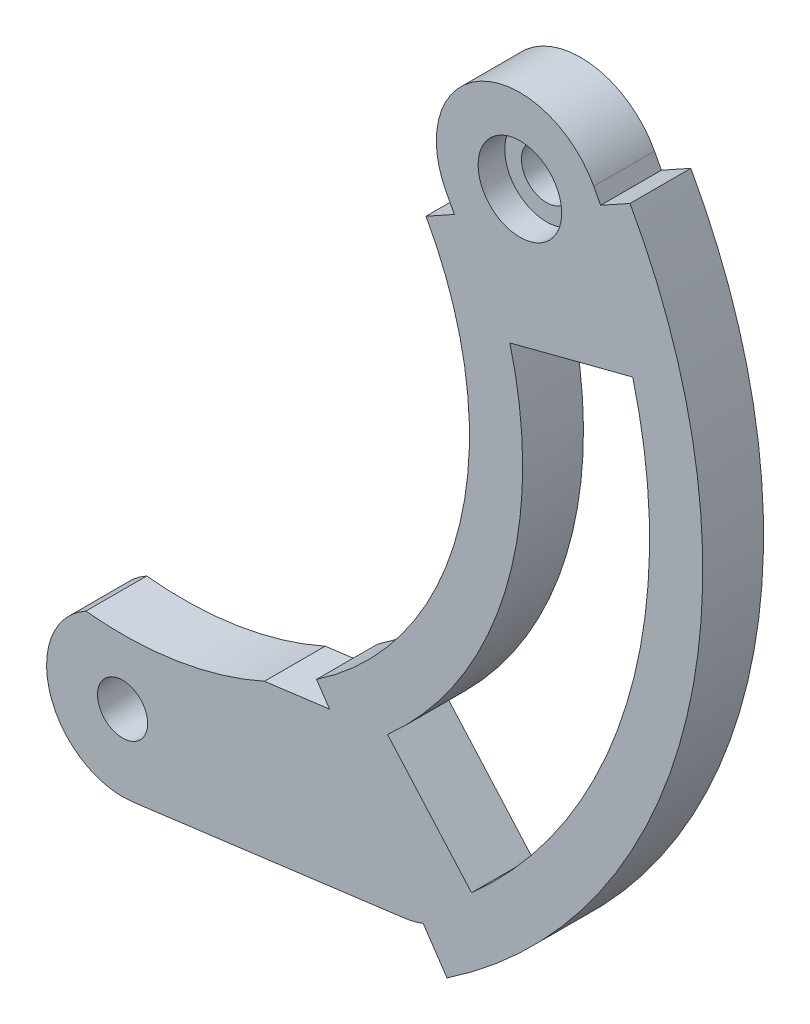
ISO-10303-21;
HEADER;
FILE_DESCRIPTION(('STEP AP214'),'2;1');
FILE_NAME('part.step','',(''),(''),'','','');
FILE_SCHEMA(('AUTOMOTIVE_DESIGN { 1 0 10303 214 1 1 1 1 }'));
ENDSEC;
DATA;
#1=APPLICATION_CONTEXT('core data for automotive mechanical design processes');
#2=APPLICATION_PROTOCOL_DEFINITION('international standard','automotive_design',2000,#1);
#3=PRODUCT_CONTEXT('',#1,'mechanical');
#4=PRODUCT('Part','Part','',(#3));
#5=PRODUCT_RELATED_PRODUCT_CATEGORY('part','',(#4));
#6=PRODUCT_DEFINITION_FORMATION('','',#4);
#7=PRODUCT_DEFINITION_CONTEXT('part definition',#1,'design');
#8=PRODUCT_DEFINITION('design','',#6,#7);
#9=PRODUCT_DEFINITION_SHAPE('','',#8);
#10=(LENGTH_UNIT() NAMED_UNIT(*) SI_UNIT(.MILLI.,.METRE.));
#11=(NAMED_UNIT(*) PLANE_ANGLE_UNIT() SI_UNIT($,.RADIAN.));
#12=(NAMED_UNIT(*) SI_UNIT($,.STERADIAN.) SOLID_ANGLE_UNIT());
#13=UNCERTAINTY_MEASURE_WITH_UNIT(LENGTH_MEASURE(1.E-05),#10,'distance_accuracy_value','');
#14=(GEOMETRIC_REPRESENTATION_CONTEXT(3) GLOBAL_UNCERTAINTY_ASSIGNED_CONTEXT((#13)) GLOBAL_UNIT_ASSIGNED_CONTEXT((#10,
#11,#12)) REPRESENTATION_CONTEXT('',''));
#15=CARTESIAN_POINT('',(0.,0.,0.));
#16=DIRECTION('',(0.,0.,1.));
#17=DIRECTION('',(1.,0.,0.));
#18=AXIS2_PLACEMENT_3D('',#15,#16,#17);
#19=CARTESIAN_POINT('',(52.2872053428289,31.4173225695133,8.1));
#20=DIRECTION('',(0.,0.,-1.));
#21=DIRECTION('',(-1.,0.,0.));
#22=AXIS2_PLACEMENT_3D('',#19,#20,#21);
#23=CYLINDRICAL_SURFACE('',#22,3.3);
#24=CARTESIAN_POINT('',(52.2872053428289,31.4173225695133,1.25));
#25=DIRECTION('',(0.,0.,1.));
#26=DIRECTION('',(1.,0.,0.));
#27=AXIS2_PLACEMENT_3D('',#24,#25,#26);
#28=CIRCLE('',#27,3.3);
#29=CARTESIAN_POINT('',(55.5872053428289,31.4173225695133,1.25));
#30=VERTEX_POINT('',#29);
#31=EDGE_CURVE('E297',#30,#30,#28,.T.);
#32=ORIENTED_EDGE('',*,*,#31,.F.);
#33=EDGE_LOOP('',(#32));
#34=FACE_BOUND('',#33,.T.);
#35=CARTESIAN_POINT('',(52.2872053428289,31.4173225695133,4.5));
#36=DIRECTION('',(0.,0.,1.));
#37=DIRECTION('',(1.,0.,0.));
#38=AXIS2_PLACEMENT_3D('',#35,#36,#37);
#39=CIRCLE('',#38,3.3);
#40=CARTESIAN_POINT('',(55.5872053428289,31.4173225695133,4.5));
#41=VERTEX_POINT('',#40);
#42=EDGE_CURVE('E304',#41,#41,#39,.T.);
#43=ORIENTED_EDGE('',*,*,#42,.T.);
#44=EDGE_LOOP('',(#43));
#45=FACE_BOUND('',#44,.T.);
#46=ADVANCED_FACE('F39',(#34,#45),#23,.F.);
#47=CARTESIAN_POINT('',(0.,0.,8.));
#48=DIRECTION('',(0.,0.,-1.));
#49=DIRECTION('',(-1.,0.,0.));
#50=AXIS2_PLACEMENT_3D('',#47,#48,#49);
#51=PLANE('',#50);
#52=CARTESIAN_POINT('',(52.2872053428289,31.4173225695133,8.));
#53=DIRECTION('',(0.,0.,-1.));
#54=DIRECTION('',(-1.,0.,0.));
#55=AXIS2_PLACEMENT_3D('',#52,#53,#54);
#56=CIRCLE('',#55,5.5);
#57=CARTESIAN_POINT('',(46.7872053428289,31.4173225695133,8.));
#58=VERTEX_POINT('',#57);
#59=EDGE_CURVE('E43',#58,#58,#56,.F.);
#60=ORIENTED_EDGE('',*,*,#59,.F.);
#61=EDGE_LOOP('',(#60));
#62=FACE_BOUND('',#61,.T.);
#63=CARTESIAN_POINT('',(0.,-54.,8.));
#64=DIRECTION('',(0.,0.,-1.));
#65=DIRECTION('',(-1.,0.,0.));
#66=AXIS2_PLACEMENT_3D('',#63,#64,#65);
#67=CIRCLE('',#66,3.3);
#68=CARTESIAN_POINT('',(-3.3,-54.,8.));
#69=VERTEX_POINT('',#68);
#70=EDGE_CURVE('E180',#69,#69,#67,.F.);
#71=ORIENTED_EDGE('',*,*,#70,.F.);
#72=EDGE_LOOP('',(#71));
#73=FACE_BOUND('',#72,.T.);
#74=CARTESIAN_POINT('',(0.,0.,8.));
#75=DIRECTION('',(0.,0.,-1.));
#76=DIRECTION('',(-1.,0.,0.));
#77=AXIS2_PLACEMENT_3D('',#74,#75,#76);
#78=CIRCLE('',#77,45.5);
#79=CARTESIAN_POINT('',(-4.82865654161834,-45.2430555555556,8.));
#80=VERTEX_POINT('',#79);
#81=CARTESIAN_POINT('',(18.6642896870166,-41.4957141218118,8.));
#82=VERTEX_POINT('',#81);
#83=EDGE_CURVE('E184',#80,#82,#78,.F.);
#84=ORIENTED_EDGE('',*,*,#83,.F.);
#85=CARTESIAN_POINT('',(0.,-54.,8.));
#86=DIRECTION('',(0.,0.,1.));
#87=DIRECTION('',(-1.,0.,0.));
#88=AXIS2_PLACEMENT_3D('',#85,#86,#87);
#89=CIRCLE('',#88,10.);
#90=CARTESIAN_POINT('',(1.28611311610923,-63.9169507940986,8.));
#91=VERTEX_POINT('',#90);
#92=EDGE_CURVE('E217',#80,#91,#89,.T.);
#93=ORIENTED_EDGE('',*,*,#92,.T.);
#94=DIRECTION('',(0.991695079409855,0.128611311610923,0.));
#95=VECTOR('',#94,1.);
#96=CARTESIAN_POINT('',(37.1410135059501,-59.2669874509703,8.));
#97=LINE('',#96,#95);
#98=CARTESIAN_POINT('',(37.1410135059501,-59.2669874509703,8.));
#99=VERTEX_POINT('',#98);
#100=EDGE_CURVE('E225',#91,#99,#97,.T.);
#101=ORIENTED_EDGE('',*,*,#100,.T.);
#102=CARTESIAN_POINT('',(35.8549003898409,-49.3500366568718,8.));
#103=DIRECTION('',(0.,0.,1.));
#104=DIRECTION('',(-1.,0.,0.));
#105=AXIS2_PLACEMENT_3D('',#102,#103,#104);
#106=CIRCLE('',#105,10.);
#107=CARTESIAN_POINT('',(39.5537321156996,-58.640819393745,8.));
#108=VERTEX_POINT('',#107);
#109=EDGE_CURVE('E224',#99,#108,#106,.T.);
#110=ORIENTED_EDGE('',*,*,#109,.T.);
#111=DIRECTION('',(0.559192903470747,-0.829037572555042,0.));
#112=VECTOR('',#111,1.);
#113=CARTESIAN_POINT('',(25.5271560434396,-37.8455651871377,8.));
#114=LINE('',#113,#112);
#115=CARTESIAN_POINT('',(42.6943781799915,-63.2970186645774,8.));
#116=VERTEX_POINT('',#115);
#117=EDGE_CURVE('E253',#108,#116,#114,.T.);
#118=ORIENTED_EDGE('',*,*,#117,.T.);
#119=CARTESIAN_POINT('',(0.,0.,8.));
#120=DIRECTION('',(0.,0.,1.));
#121=DIRECTION('',(1.,0.,0.));
#122=AXIS2_PLACEMENT_3D('',#119,#120,#121);
#123=CIRCLE('',#122,76.35);
#124=CARTESIAN_POINT('',(66.7772146400928,37.0152145058079,8.));
#125=VERTEX_POINT('',#124);
#126=EDGE_CURVE('E258',#116,#125,#123,.T.);
#127=ORIENTED_EDGE('',*,*,#126,.T.);
#128=DIRECTION('',(-0.874619707139396,-0.484809620246337,0.));
#129=VECTOR('',#128,1.);
#130=CARTESIAN_POINT('',(66.7772146400929,37.0152145058078,8.));
#131=LINE('',#130,#129);
#132=CARTESIAN_POINT('',(62.9090834815502,34.8710743924211,8.));
#133=VERTEX_POINT('',#132);
#134=EDGE_CURVE('E265',#125,#133,#131,.T.);
#135=ORIENTED_EDGE('',*,*,#134,.T.);
#136=DIRECTION('',(-0.46947156278589,0.882947592858927,0.));
#137=VECTOR('',#136,1.);
#138=CARTESIAN_POINT('',(61.9996288642771,36.5815097601581,8.));
#139=LINE('',#138,#137);
#140=CARTESIAN_POINT('',(61.9996288642771,36.5815097601581,8.));
#141=VERTEX_POINT('',#140);
#142=EDGE_CURVE('E191',#133,#141,#139,.T.);
#143=ORIENTED_EDGE('',*,*,#142,.T.);
#144=CARTESIAN_POINT('',(52.2872053428289,31.4173225695133,8.));
#145=DIRECTION('',(0.,0.,1.));
#146=DIRECTION('',(-1.,0.,0.));
#147=AXIS2_PLACEMENT_3D('',#144,#145,#146);
#148=CIRCLE('',#147,11.);
#149=CARTESIAN_POINT('',(42.5747818213807,26.2531353788685,8.));
#150=VERTEX_POINT('',#149);
#151=EDGE_CURVE('E199',#141,#150,#148,.T.);
#152=ORIENTED_EDGE('',*,*,#151,.T.);
#153=DIRECTION('',(0.46947156278589,-0.882947592858927,0.));
#154=VECTOR('',#153,1.);
#155=CARTESIAN_POINT('',(45.5723514877874,20.6155267755379,8.));
#156=LINE('',#155,#154);
#157=CARTESIAN_POINT('',(43.6645188840821,24.2036380447771,8.));
#158=VERTEX_POINT('',#157);
#159=EDGE_CURVE('E198',#150,#158,#156,.T.);
#160=ORIENTED_EDGE('',*,*,#159,.T.);
#161=CARTESIAN_POINT('',(39.9263896309134,22.1315591642453,8.));
#162=VERTEX_POINT('',#161);
#163=EDGE_CURVE('E261',#158,#162,#131,.T.);
#164=ORIENTED_EDGE('',*,*,#163,.T.);
#165=CARTESIAN_POINT('',(0.,0.,8.));
#166=DIRECTION('',(0.,0.,-1.));
#167=DIRECTION('',(-1.,0.,0.));
#168=AXIS2_PLACEMENT_3D('',#165,#166,#167);
#169=CIRCLE('',#168,45.65);
#170=CARTESIAN_POINT('',(25.5271560434396,-37.8455651871377,8.));
#171=VERTEX_POINT('',#170);
#172=EDGE_CURVE('E255',#162,#171,#169,.T.);
#173=ORIENTED_EDGE('',*,*,#172,.T.);
#174=CARTESIAN_POINT('',(27.2391214175466,-40.383658230234,8.));
#175=VERTEX_POINT('',#174);
#176=EDGE_CURVE('E260',#171,#175,#114,.T.);
#177=ORIENTED_EDGE('',*,*,#176,.T.);
#178=DIRECTION('',(-0.991695079409855,-0.128611311610923,0.));
#179=VECTOR('',#178,1.);
#180=CARTESIAN_POINT('',(-1.28611311610923,-44.0830492059015,8.));
#181=LINE('',#180,#179);
#182=EDGE_CURVE('E226',#175,#82,#181,.T.);
#183=ORIENTED_EDGE('',*,*,#182,.T.);
#184=EDGE_LOOP('',(#84,#93,#101,#110,#118,#127,#135,#143,#152,#160,#164,#173,#177,#183));
#185=FACE_BOUND('',#184,.T.);
#186=CARTESIAN_POINT('',(0.,0.,8.));
#187=DIRECTION('',(0.,0.,-1.));
#188=DIRECTION('',(-1.,0.,0.));
#189=AXIS2_PLACEMENT_3D('',#186,#187,#188);
#190=CIRCLE('',#189,52.6499999999999);
#191=CARTESIAN_POINT('',(50.9647013001965,13.2144512327131,8.));
#192=VERTEX_POINT('',#191);
#193=CARTESIAN_POINT('',(34.8622248993142,-39.4543758671916,8.));
#194=VERTEX_POINT('',#193);
#195=EDGE_CURVE('E172',#192,#194,#190,.T.);
#196=ORIENTED_EDGE('',*,*,#195,.F.);
#197=DIRECTION('',(-0.967990528018926,-0.250986728066725,0.));
#198=VECTOR('',#197,1.);
#199=CARTESIAN_POINT('',(0.,0.,8.));
#200=LINE('',#199,#198);
#201=CARTESIAN_POINT('',(67.1301431181125,17.4059295914274,8.));
#202=VERTEX_POINT('',#201);
#203=EDGE_CURVE('E161',#202,#192,#200,.T.);
#204=ORIENTED_EDGE('',*,*,#203,.F.);
#205=CARTESIAN_POINT('',(0.,0.,8.));
#206=DIRECTION('',(0.,0.,-1.));
#207=DIRECTION('',(-1.,0.,0.));
#208=AXIS2_PLACEMENT_3D('',#205,#206,#207);
#209=CIRCLE('',#208,69.3499999999999);
#210=CARTESIAN_POINT('',(45.9201385900749,-51.9688692571651,8.));
#211=VERTEX_POINT('',#210);
#212=EDGE_CURVE('E166',#211,#202,#209,.F.);
#213=ORIENTED_EDGE('',*,*,#212,.F.);
#214=DIRECTION('',(0.662150520404829,-0.749370861675055,0.));
#215=VECTOR('',#214,1.);
#216=CARTESIAN_POINT('',(0.,0.,8.));
#217=LINE('',#216,#215);
#218=EDGE_CURVE('E181',#194,#211,#217,.T.);
#219=ORIENTED_EDGE('',*,*,#218,.F.);
#220=EDGE_LOOP('',(#196,#204,#213,#219));
#221=FACE_BOUND('',#220,.T.);
#222=ADVANCED_FACE('F179',(#62,#73,#185,#221),#51,.F.);
#223=CARTESIAN_POINT('',(0.,0.,0.));
#224=DIRECTION('',(0.,0.,-1.));
#225=DIRECTION('',(-1.,0.,0.));
#226=AXIS2_PLACEMENT_3D('',#223,#224,#225);
#227=PLANE('',#226);
#228=CARTESIAN_POINT('',(52.2872053428289,31.4173225695133,0.));
#229=DIRECTION('',(0.,0.,-1.));
#230=DIRECTION('',(-1.,0.,0.));
#231=AXIS2_PLACEMENT_3D('',#228,#229,#230);
#232=CIRCLE('',#231,5.06);
#233=CARTESIAN_POINT('',(47.2272053428289,31.4173225695133,0.));
#234=VERTEX_POINT('',#233);
#235=EDGE_CURVE('E299',#234,#234,#232,.F.);
#236=ORIENTED_EDGE('',*,*,#235,.T.);
#237=EDGE_LOOP('',(#236));
#238=FACE_BOUND('',#237,.T.);
#239=CARTESIAN_POINT('',(0.,-54.,0.));
#240=DIRECTION('',(0.,0.,-1.));
#241=DIRECTION('',(-1.,0.,0.));
#242=AXIS2_PLACEMENT_3D('',#239,#240,#241);
#243=CIRCLE('',#242,3.3);
#244=CARTESIAN_POINT('',(-3.3,-54.,0.));
#245=VERTEX_POINT('',#244);
#246=EDGE_CURVE('E298',#245,#245,#243,.F.);
#247=ORIENTED_EDGE('',*,*,#246,.T.);
#248=EDGE_LOOP('',(#247));
#249=FACE_BOUND('',#248,.T.);
#250=CARTESIAN_POINT('',(0.,-54.,0.));
#251=DIRECTION('',(0.,0.,1.));
#252=DIRECTION('',(-1.,0.,0.));
#253=AXIS2_PLACEMENT_3D('',#250,#251,#252);
#254=CIRCLE('',#253,10.);
#255=CARTESIAN_POINT('',(-4.82865654161834,-45.2430555555556,0.));
#256=VERTEX_POINT('',#255);
#257=CARTESIAN_POINT('',(1.28611311610923,-63.9169507940986,0.));
#258=VERTEX_POINT('',#257);
#259=EDGE_CURVE('E218',#256,#258,#254,.T.);
#260=ORIENTED_EDGE('',*,*,#259,.F.);
#261=CARTESIAN_POINT('',(0.,0.,0.));
#262=DIRECTION('',(0.,0.,-1.));
#263=DIRECTION('',(-1.,0.,0.));
#264=AXIS2_PLACEMENT_3D('',#261,#262,#263);
#265=CIRCLE('',#264,45.5);
#266=CARTESIAN_POINT('',(18.6642896870166,-41.4957141218118,0.));
#267=VERTEX_POINT('',#266);
#268=EDGE_CURVE('E185',#256,#267,#265,.F.);
#269=ORIENTED_EDGE('',*,*,#268,.T.);
#270=DIRECTION('',(-0.991695079409855,-0.128611311610923,0.));
#271=VECTOR('',#270,1.);
#272=CARTESIAN_POINT('',(-1.28611311610923,-44.0830492059015,0.));
#273=LINE('',#272,#271);
#274=CARTESIAN_POINT('',(27.2391214175466,-40.383658230234,0.));
#275=VERTEX_POINT('',#274);
#276=EDGE_CURVE('E222',#275,#267,#273,.T.);
#277=ORIENTED_EDGE('',*,*,#276,.F.);
#278=DIRECTION('',(0.559192903470747,-0.829037572555042,0.));
#279=VECTOR('',#278,1.);
#280=CARTESIAN_POINT('',(25.5271560434396,-37.8455651871377,0.));
#281=LINE('',#280,#279);
#282=CARTESIAN_POINT('',(25.5271560434396,-37.8455651871377,0.));
#283=VERTEX_POINT('',#282);
#284=EDGE_CURVE('E269',#283,#275,#281,.T.);
#285=ORIENTED_EDGE('',*,*,#284,.F.);
#286=CARTESIAN_POINT('',(0.,0.,0.));
#287=DIRECTION('',(0.,0.,-1.));
#288=DIRECTION('',(-1.,0.,0.));
#289=AXIS2_PLACEMENT_3D('',#286,#287,#288);
#290=CIRCLE('',#289,45.65);
#291=CARTESIAN_POINT('',(39.9263896309134,22.1315591642453,0.));
#292=VERTEX_POINT('',#291);
#293=EDGE_CURVE('E252',#292,#283,#290,.T.);
#294=ORIENTED_EDGE('',*,*,#293,.F.);
#295=DIRECTION('',(-0.874619707139396,-0.484809620246337,0.));
#296=VECTOR('',#295,1.);
#297=CARTESIAN_POINT('',(66.7772146400929,37.0152145058078,0.));
#298=LINE('',#297,#296);
#299=CARTESIAN_POINT('',(43.6645188840821,24.2036380447771,0.));
#300=VERTEX_POINT('',#299);
#301=EDGE_CURVE('E274',#300,#292,#298,.T.);
#302=ORIENTED_EDGE('',*,*,#301,.F.);
#303=DIRECTION('',(0.46947156278589,-0.882947592858927,0.));
#304=VECTOR('',#303,1.);
#305=CARTESIAN_POINT('',(45.5723514877874,20.6155267755379,0.));
#306=LINE('',#305,#304);
#307=CARTESIAN_POINT('',(42.5747818213807,26.2531353788685,0.));
#308=VERTEX_POINT('',#307);
#309=EDGE_CURVE('E196',#308,#300,#306,.T.);
#310=ORIENTED_EDGE('',*,*,#309,.F.);
#311=CARTESIAN_POINT('',(52.2872053428289,31.4173225695133,0.));
#312=DIRECTION('',(0.,0.,1.));
#313=DIRECTION('',(-1.,0.,0.));
#314=AXIS2_PLACEMENT_3D('',#311,#312,#313);
#315=CIRCLE('',#314,11.);
#316=CARTESIAN_POINT('',(61.9996288642771,36.5815097601581,0.));
#317=VERTEX_POINT('',#316);
#318=EDGE_CURVE('E203',#317,#308,#315,.T.);
#319=ORIENTED_EDGE('',*,*,#318,.F.);
#320=DIRECTION('',(-0.46947156278589,0.882947592858927,0.));
#321=VECTOR('',#320,1.);
#322=CARTESIAN_POINT('',(61.9996288642771,36.5815097601581,0.));
#323=LINE('',#322,#321);
#324=CARTESIAN_POINT('',(62.9090834815502,34.8710743924211,0.));
#325=VERTEX_POINT('',#324);
#326=EDGE_CURVE('E194',#325,#317,#323,.T.);
#327=ORIENTED_EDGE('',*,*,#326,.F.);
#328=CARTESIAN_POINT('',(66.7772146400928,37.0152145058079,0.));
#329=VERTEX_POINT('',#328);
#330=EDGE_CURVE('E257',#329,#325,#298,.T.);
#331=ORIENTED_EDGE('',*,*,#330,.F.);
#332=CARTESIAN_POINT('',(0.,0.,0.));
#333=DIRECTION('',(0.,0.,1.));
#334=DIRECTION('',(1.,0.,0.));
#335=AXIS2_PLACEMENT_3D('',#332,#333,#334);
#336=CIRCLE('',#335,76.35);
#337=CARTESIAN_POINT('',(42.6943781799915,-63.2970186645774,0.));
#338=VERTEX_POINT('',#337);
#339=EDGE_CURVE('E275',#338,#329,#336,.T.);
#340=ORIENTED_EDGE('',*,*,#339,.F.);
#341=CARTESIAN_POINT('',(39.5537321156996,-58.640819393745,0.));
#342=VERTEX_POINT('',#341);
#343=EDGE_CURVE('E268',#342,#338,#281,.T.);
#344=ORIENTED_EDGE('',*,*,#343,.F.);
#345=CARTESIAN_POINT('',(35.8549003898409,-49.3500366568718,0.));
#346=DIRECTION('',(0.,0.,1.));
#347=DIRECTION('',(-1.,0.,0.));
#348=AXIS2_PLACEMENT_3D('',#345,#346,#347);
#349=CIRCLE('',#348,10.);
#350=CARTESIAN_POINT('',(37.1410135059501,-59.2669874509703,0.));
#351=VERTEX_POINT('',#350);
#352=EDGE_CURVE('E232',#351,#342,#349,.T.);
#353=ORIENTED_EDGE('',*,*,#352,.F.);
#354=DIRECTION('',(0.991695079409855,0.128611311610923,0.));
#355=VECTOR('',#354,1.);
#356=CARTESIAN_POINT('',(37.1410135059501,-59.2669874509703,0.));
#357=LINE('',#356,#355);
#358=EDGE_CURVE('E231',#258,#351,#357,.T.);
#359=ORIENTED_EDGE('',*,*,#358,.F.);
#360=EDGE_LOOP('',(#260,#269,#277,#285,#294,#302,#310,#319,#327,#331,#340,#344,#353,#359));
#361=FACE_BOUND('',#360,.T.);
#362=DIRECTION('',(-0.967990528018926,-0.250986728066725,0.));
#363=VECTOR('',#362,1.);
#364=CARTESIAN_POINT('',(0.,0.,0.));
#365=LINE('',#364,#363);
#366=CARTESIAN_POINT('',(67.1301431181125,17.4059295914274,0.));
#367=VERTEX_POINT('',#366);
#368=CARTESIAN_POINT('',(50.9647013001965,13.2144512327131,0.));
#369=VERTEX_POINT('',#368);
#370=EDGE_CURVE('E288',#367,#369,#365,.T.);
#371=ORIENTED_EDGE('',*,*,#370,.T.);
#372=CARTESIAN_POINT('',(0.,0.,0.));
#373=DIRECTION('',(0.,0.,-1.));
#374=DIRECTION('',(-1.,0.,0.));
#375=AXIS2_PLACEMENT_3D('',#372,#373,#374);
#376=CIRCLE('',#375,52.6499999999999);
#377=CARTESIAN_POINT('',(34.8622248993142,-39.4543758671916,0.));
#378=VERTEX_POINT('',#377);
#379=EDGE_CURVE('E11',#369,#378,#376,.T.);
#380=ORIENTED_EDGE('',*,*,#379,.T.);
#381=DIRECTION('',(0.662150520404829,-0.749370861675055,0.));
#382=VECTOR('',#381,1.);
#383=CARTESIAN_POINT('',(0.,0.,0.));
#384=LINE('',#383,#382);
#385=CARTESIAN_POINT('',(45.9201385900749,-51.9688692571651,0.));
#386=VERTEX_POINT('',#385);
#387=EDGE_CURVE('E48',#378,#386,#384,.T.);
#388=ORIENTED_EDGE('',*,*,#387,.T.);
#389=CARTESIAN_POINT('',(0.,0.,0.));
#390=DIRECTION('',(0.,0.,-1.));
#391=DIRECTION('',(-1.,0.,0.));
#392=AXIS2_PLACEMENT_3D('',#389,#390,#391);
#393=CIRCLE('',#392,69.3499999999999);
#394=EDGE_CURVE('E293',#386,#367,#393,.F.);
#395=ORIENTED_EDGE('',*,*,#394,.T.);
#396=EDGE_LOOP('',(#371,#380,#388,#395));
#397=FACE_BOUND('',#396,.T.);
#398=ADVANCED_FACE('F327',(#238,#249,#361,#397),#227,.T.);
#399=CARTESIAN_POINT('',(-1.28611311610923,-44.0830492059015,8.));
#400=DIRECTION('',(0.128611311610923,-0.991695079409855,0.));
#401=DIRECTION('',(0.991695079409855,0.128611311610923,0.));
#402=AXIS2_PLACEMENT_3D('',#399,#400,#401);
#403=PLANE('',#402);
#404=DIRECTION('',(0.,0.,-1.));
#405=VECTOR('',#404,1.);
#406=CARTESIAN_POINT('',(18.6642896870166,-41.4957141218118,8.1));
#407=LINE('',#406,#405);
#408=EDGE_CURVE('E192',#82,#267,#407,.T.);
#409=ORIENTED_EDGE('',*,*,#408,.F.);
#410=ORIENTED_EDGE('',*,*,#182,.F.);
#411=DIRECTION('',(0.,0.,-1.));
#412=VECTOR('',#411,1.);
#413=CARTESIAN_POINT('',(27.2391214175466,-40.383658230234,8.));
#414=LINE('',#413,#412);
#415=EDGE_CURVE('E244',#175,#275,#414,.T.);
#416=ORIENTED_EDGE('',*,*,#415,.T.);
#417=ORIENTED_EDGE('',*,*,#276,.T.);
#418=EDGE_LOOP('',(#409,#410,#416,#417));
#419=FACE_BOUND('',#418,.T.);
#420=ADVANCED_FACE('F335',(#419),#403,.F.);
#421=CARTESIAN_POINT('',(0.,-54.,8.));
#422=DIRECTION('',(0.,0.,-1.));
#423=DIRECTION('',(-1.,0.,0.));
#424=AXIS2_PLACEMENT_3D('',#421,#422,#423);
#425=CYLINDRICAL_SURFACE('',#424,10.);
#426=DIRECTION('',(0.,0.,-1.));
#427=VECTOR('',#426,1.);
#428=CARTESIAN_POINT('',(-4.82865654161834,-45.2430555555556,4.));
#429=LINE('',#428,#427);
#430=EDGE_CURVE('E290',#256,#80,#429,.F.);
#431=ORIENTED_EDGE('',*,*,#430,.F.);
#432=ORIENTED_EDGE('',*,*,#259,.T.);
#433=DIRECTION('',(0.,0.,-1.));
#434=VECTOR('',#433,1.);
#435=CARTESIAN_POINT('',(1.28611311610923,-63.9169507940986,8.));
#436=LINE('',#435,#434);
#437=EDGE_CURVE('E245',#91,#258,#436,.T.);
#438=ORIENTED_EDGE('',*,*,#437,.F.);
#439=ORIENTED_EDGE('',*,*,#92,.F.);
#440=EDGE_LOOP('',(#431,#432,#438,#439));
#441=FACE_BOUND('',#440,.T.);
#442=ADVANCED_FACE('F338',(#441),#425,.T.);
#443=CARTESIAN_POINT('',(66.7772146400929,37.0152145058078,8.));
#444=DIRECTION('',(0.484809620246337,-0.874619707139396,0.));
#445=DIRECTION('',(0.874619707139396,0.484809620246337,0.));
#446=AXIS2_PLACEMENT_3D('',#443,#444,#445);
#447=PLANE('',#446);
#448=DIRECTION('',(0.,0.,-1.));
#449=VECTOR('',#448,1.);
#450=CARTESIAN_POINT('',(62.9090834815502,34.8710743924211,8.));
#451=LINE('',#450,#449);
#452=EDGE_CURVE('E219',#133,#325,#451,.T.);
#453=ORIENTED_EDGE('',*,*,#452,.F.);
#454=ORIENTED_EDGE('',*,*,#134,.F.);
#455=DIRECTION('',(0.,0.,-1.));
#456=VECTOR('',#455,1.);
#457=CARTESIAN_POINT('',(66.7772146400928,37.0152145058079,8.));
#458=LINE('',#457,#456);
#459=EDGE_CURVE('E279',#125,#329,#458,.T.);
#460=ORIENTED_EDGE('',*,*,#459,.T.);
#461=ORIENTED_EDGE('',*,*,#330,.T.);
#462=EDGE_LOOP('',(#453,#454,#460,#461));
#463=FACE_BOUND('',#462,.T.);
#464=ADVANCED_FACE('F395',(#463),#447,.F.);
#465=DIRECTION('',(0.,0.,1.));
#466=VECTOR('',#465,1.);
#467=CARTESIAN_POINT('',(43.6645188840821,24.2036380447771,8.));
#468=LINE('',#467,#466);
#469=EDGE_CURVE('E214',#300,#158,#468,.T.);
#470=ORIENTED_EDGE('',*,*,#469,.F.);
#471=ORIENTED_EDGE('',*,*,#301,.T.);
#472=DIRECTION('',(0.,0.,-1.));
#473=VECTOR('',#472,1.);
#474=CARTESIAN_POINT('',(39.9263896309134,22.1315591642453,8.));
#475=LINE('',#474,#473);
#476=EDGE_CURVE('E266',#162,#292,#475,.T.);
#477=ORIENTED_EDGE('',*,*,#476,.F.);
#478=ORIENTED_EDGE('',*,*,#163,.F.);
#479=EDGE_LOOP('',(#470,#471,#477,#478));
#480=FACE_BOUND('',#479,.T.);
#481=ADVANCED_FACE('F397',(#480),#447,.F.);
#482=CARTESIAN_POINT('',(25.5271560434396,-37.8455651871377,8.));
#483=DIRECTION('',(0.829037572555042,0.559192903470747,0.));
#484=DIRECTION('',(-0.559192903470747,0.829037572555042,0.));
#485=AXIS2_PLACEMENT_3D('',#482,#483,#484);
#486=PLANE('',#485);
#487=DIRECTION('',(0.,0.,-1.));
#488=VECTOR('',#487,1.);
#489=CARTESIAN_POINT('',(39.5537321156996,-58.640819393745,8.));
#490=LINE('',#489,#488);
#491=EDGE_CURVE('E247',#342,#108,#490,.F.);
#492=ORIENTED_EDGE('',*,*,#491,.F.);
#493=ORIENTED_EDGE('',*,*,#343,.T.);
#494=DIRECTION('',(0.,0.,-1.));
#495=VECTOR('',#494,1.);
#496=CARTESIAN_POINT('',(42.6943781799915,-63.2970186645774,8.));
#497=LINE('',#496,#495);
#498=EDGE_CURVE('E284',#116,#338,#497,.T.);
#499=ORIENTED_EDGE('',*,*,#498,.F.);
#500=ORIENTED_EDGE('',*,*,#117,.F.);
#501=EDGE_LOOP('',(#492,#493,#499,#500));
#502=FACE_BOUND('',#501,.T.);
#503=ADVANCED_FACE('F441',(#502),#486,.F.);
#504=ORIENTED_EDGE('',*,*,#415,.F.);
#505=ORIENTED_EDGE('',*,*,#176,.F.);
#506=DIRECTION('',(0.,0.,-1.));
#507=VECTOR('',#506,1.);
#508=CARTESIAN_POINT('',(25.5271560434396,-37.8455651871377,8.));
#509=LINE('',#508,#507);
#510=EDGE_CURVE('E283',#171,#283,#509,.T.);
#511=ORIENTED_EDGE('',*,*,#510,.T.);
#512=ORIENTED_EDGE('',*,*,#284,.T.);
#513=EDGE_LOOP('',(#504,#505,#511,#512));
#514=FACE_BOUND('',#513,.T.);
#515=ADVANCED_FACE('F419',(#514),#486,.F.);
#516=CARTESIAN_POINT('',(0.,0.,8.));
#517=DIRECTION('',(0.,0.,-1.));
#518=DIRECTION('',(-1.,0.,0.));
#519=AXIS2_PLACEMENT_3D('',#516,#517,#518);
#520=CYLINDRICAL_SURFACE('',#519,45.65);
#521=ORIENTED_EDGE('',*,*,#293,.T.);
#522=ORIENTED_EDGE('',*,*,#510,.F.);
#523=ORIENTED_EDGE('',*,*,#172,.F.);
#524=ORIENTED_EDGE('',*,*,#476,.T.);
#525=EDGE_LOOP('',(#521,#522,#523,#524));
#526=FACE_BOUND('',#525,.T.);
#527=ADVANCED_FACE('F41',(#526),#520,.F.);
#528=CARTESIAN_POINT('',(0.,0.,8.));
#529=DIRECTION('',(0.,0.,-1.));
#530=DIRECTION('',(-1.,0.,0.));
#531=AXIS2_PLACEMENT_3D('',#528,#529,#530);
#532=CYLINDRICAL_SURFACE('',#531,76.35);
#533=ORIENTED_EDGE('',*,*,#339,.T.);
#534=ORIENTED_EDGE('',*,*,#459,.F.);
#535=ORIENTED_EDGE('',*,*,#126,.F.);
#536=ORIENTED_EDGE('',*,*,#498,.T.);
#537=EDGE_LOOP('',(#533,#534,#535,#536));
#538=FACE_BOUND('',#537,.T.);
#539=ADVANCED_FACE('F390',(#538),#532,.T.);
#540=CARTESIAN_POINT('',(35.8549003898409,-49.3500366568718,8.));
#541=DIRECTION('',(0.,0.,-1.));
#542=DIRECTION('',(-1.,0.,0.));
#543=AXIS2_PLACEMENT_3D('',#540,#541,#542);
#544=CYLINDRICAL_SURFACE('',#543,10.);
#545=ORIENTED_EDGE('',*,*,#352,.T.);
#546=ORIENTED_EDGE('',*,*,#491,.T.);
#547=ORIENTED_EDGE('',*,*,#109,.F.);
#548=DIRECTION('',(0.,0.,-1.));
#549=VECTOR('',#548,1.);
#550=CARTESIAN_POINT('',(37.1410135059501,-59.2669874509703,8.));
#551=LINE('',#550,#549);
#552=EDGE_CURVE('E233',#99,#351,#551,.T.);
#553=ORIENTED_EDGE('',*,*,#552,.T.);
#554=EDGE_LOOP('',(#545,#546,#547,#553));
#555=FACE_BOUND('',#554,.T.);
#556=ADVANCED_FACE('F381',(#555),#544,.T.);
#557=CARTESIAN_POINT('',(37.1410135059501,-59.2669874509703,8.));
#558=DIRECTION('',(-0.128611311610923,0.991695079409855,0.));
#559=DIRECTION('',(-0.991695079409855,-0.128611311610923,0.));
#560=AXIS2_PLACEMENT_3D('',#557,#558,#559);
#561=PLANE('',#560);
#562=ORIENTED_EDGE('',*,*,#358,.T.);
#563=ORIENTED_EDGE('',*,*,#552,.F.);
#564=ORIENTED_EDGE('',*,*,#100,.F.);
#565=ORIENTED_EDGE('',*,*,#437,.T.);
#566=EDGE_LOOP('',(#562,#563,#564,#565));
#567=FACE_BOUND('',#566,.T.);
#568=ADVANCED_FACE('F382',(#567),#561,.F.);
#569=CARTESIAN_POINT('',(61.9996288642771,36.5815097601581,8.));
#570=DIRECTION('',(-0.882947592858927,-0.46947156278589,0.));
#571=DIRECTION('',(0.46947156278589,-0.882947592858927,0.));
#572=AXIS2_PLACEMENT_3D('',#569,#570,#571);
#573=PLANE('',#572);
#574=ORIENTED_EDGE('',*,*,#142,.F.);
#575=ORIENTED_EDGE('',*,*,#452,.T.);
#576=ORIENTED_EDGE('',*,*,#326,.T.);
#577=DIRECTION('',(0.,0.,-1.));
#578=VECTOR('',#577,1.);
#579=CARTESIAN_POINT('',(61.9996288642771,36.5815097601581,8.));
#580=LINE('',#579,#578);
#581=EDGE_CURVE('E208',#141,#317,#580,.T.);
#582=ORIENTED_EDGE('',*,*,#581,.F.);
#583=EDGE_LOOP('',(#574,#575,#576,#582));
#584=FACE_BOUND('',#583,.T.);
#585=ADVANCED_FACE('F374',(#584),#573,.F.);
#586=CARTESIAN_POINT('',(45.5723514877874,20.6155267755379,8.));
#587=DIRECTION('',(0.882947592858927,0.46947156278589,0.));
#588=DIRECTION('',(-0.46947156278589,0.882947592858927,0.));
#589=AXIS2_PLACEMENT_3D('',#586,#587,#588);
#590=PLANE('',#589);
#591=ORIENTED_EDGE('',*,*,#309,.T.);
#592=ORIENTED_EDGE('',*,*,#469,.T.);
#593=ORIENTED_EDGE('',*,*,#159,.F.);
#594=DIRECTION('',(0.,0.,-1.));
#595=VECTOR('',#594,1.);
#596=CARTESIAN_POINT('',(42.5747818213807,26.2531353788685,8.));
#597=LINE('',#596,#595);
#598=EDGE_CURVE('E205',#150,#308,#597,.T.);
#599=ORIENTED_EDGE('',*,*,#598,.T.);
#600=EDGE_LOOP('',(#591,#592,#593,#599));
#601=FACE_BOUND('',#600,.T.);
#602=ADVANCED_FACE('F375',(#601),#590,.F.);
#603=CARTESIAN_POINT('',(52.2872053428289,31.4173225695133,8.));
#604=DIRECTION('',(0.,0.,-1.));
#605=DIRECTION('',(-1.,0.,0.));
#606=AXIS2_PLACEMENT_3D('',#603,#604,#605);
#607=CYLINDRICAL_SURFACE('',#606,11.);
#608=ORIENTED_EDGE('',*,*,#318,.T.);
#609=ORIENTED_EDGE('',*,*,#598,.F.);
#610=ORIENTED_EDGE('',*,*,#151,.F.);
#611=ORIENTED_EDGE('',*,*,#581,.T.);
#612=EDGE_LOOP('',(#608,#609,#610,#611));
#613=FACE_BOUND('',#612,.T.);
#614=ADVANCED_FACE('F369',(#613),#607,.T.);
#615=CARTESIAN_POINT('',(0.,0.,8.1));
#616=DIRECTION('',(0.,0.,-1.));
#617=DIRECTION('',(-1.,0.,0.));
#618=AXIS2_PLACEMENT_3D('',#615,#616,#617);
#619=CYLINDRICAL_SURFACE('',#618,45.5);
#620=ORIENTED_EDGE('',*,*,#408,.T.);
#621=ORIENTED_EDGE('',*,*,#268,.F.);
#622=ORIENTED_EDGE('',*,*,#430,.T.);
#623=ORIENTED_EDGE('',*,*,#83,.T.);
#624=EDGE_LOOP('',(#620,#621,#622,#623));
#625=FACE_BOUND('',#624,.T.);
#626=ADVANCED_FACE('F370',(#625),#619,.F.);
#627=CARTESIAN_POINT('',(0.,0.,8.1));
#628=DIRECTION('',(0.,0.,-1.));
#629=DIRECTION('',(-1.,0.,0.));
#630=AXIS2_PLACEMENT_3D('',#627,#628,#629);
#631=CYLINDRICAL_SURFACE('',#630,52.6499999999999);
#632=ORIENTED_EDGE('',*,*,#195,.T.);
#633=DIRECTION('',(0.,0.,-1.));
#634=VECTOR('',#633,1.);
#635=CARTESIAN_POINT('',(34.8622248993142,-39.4543758671916,8.1));
#636=LINE('',#635,#634);
#637=EDGE_CURVE('E169',#194,#378,#636,.T.);
#638=ORIENTED_EDGE('',*,*,#637,.T.);
#639=ORIENTED_EDGE('',*,*,#379,.F.);
#640=DIRECTION('',(0.,0.,-1.));
#641=VECTOR('',#640,1.);
#642=CARTESIAN_POINT('',(50.9647013001965,13.2144512327131,8.1));
#643=LINE('',#642,#641);
#644=EDGE_CURVE('E62',#192,#369,#643,.T.);
#645=ORIENTED_EDGE('',*,*,#644,.F.);
#646=EDGE_LOOP('',(#632,#638,#639,#645));
#647=FACE_BOUND('',#646,.T.);
#648=ADVANCED_FACE('F175',(#647),#631,.T.);
#649=CARTESIAN_POINT('',(34.8622248993142,-39.4543758671916,8.1));
#650=DIRECTION('',(0.749370861675055,0.662150520404829,0.));
#651=DIRECTION('',(-0.662150520404829,0.749370861675055,0.));
#652=AXIS2_PLACEMENT_3D('',#649,#650,#651);
#653=PLANE('',#652);
#654=ORIENTED_EDGE('',*,*,#218,.T.);
#655=DIRECTION('',(0.,0.,-1.));
#656=VECTOR('',#655,1.);
#657=CARTESIAN_POINT('',(45.9201385900749,-51.9688692571651,8.1));
#658=LINE('',#657,#656);
#659=EDGE_CURVE('E322',#211,#386,#658,.T.);
#660=ORIENTED_EDGE('',*,*,#659,.T.);
#661=ORIENTED_EDGE('',*,*,#387,.F.);
#662=ORIENTED_EDGE('',*,*,#637,.F.);
#663=EDGE_LOOP('',(#654,#660,#661,#662));
#664=FACE_BOUND('',#663,.T.);
#665=ADVANCED_FACE('F330',(#664),#653,.T.);
#666=CARTESIAN_POINT('',(0.,0.,8.1));
#667=DIRECTION('',(0.,0.,-1.));
#668=DIRECTION('',(-1.,0.,0.));
#669=AXIS2_PLACEMENT_3D('',#666,#667,#668);
#670=CYLINDRICAL_SURFACE('',#669,69.3499999999999);
#671=ORIENTED_EDGE('',*,*,#212,.T.);
#672=DIRECTION('',(0.,0.,-1.));
#673=VECTOR('',#672,1.);
#674=CARTESIAN_POINT('',(67.1301431181125,17.4059295914274,8.1));
#675=LINE('',#674,#673);
#676=EDGE_CURVE('E57',#202,#367,#675,.T.);
#677=ORIENTED_EDGE('',*,*,#676,.T.);
#678=ORIENTED_EDGE('',*,*,#394,.F.);
#679=ORIENTED_EDGE('',*,*,#659,.F.);
#680=EDGE_LOOP('',(#671,#677,#678,#679));
#681=FACE_BOUND('',#680,.T.);
#682=ADVANCED_FACE('F329',(#681),#670,.F.);
#683=CARTESIAN_POINT('',(67.1301431181125,17.4059295914274,8.1));
#684=DIRECTION('',(0.250986728066725,-0.967990528018926,0.));
#685=DIRECTION('',(0.967990528018926,0.250986728066725,0.));
#686=AXIS2_PLACEMENT_3D('',#683,#684,#685);
#687=PLANE('',#686);
#688=ORIENTED_EDGE('',*,*,#203,.T.);
#689=ORIENTED_EDGE('',*,*,#644,.T.);
#690=ORIENTED_EDGE('',*,*,#370,.F.);
#691=ORIENTED_EDGE('',*,*,#676,.F.);
#692=EDGE_LOOP('',(#688,#689,#690,#691));
#693=FACE_BOUND('',#692,.T.);
#694=ADVANCED_FACE('F165',(#693),#687,.T.);
#695=CARTESIAN_POINT('',(0.,-54.,8.1));
#696=DIRECTION('',(0.,0.,-1.));
#697=DIRECTION('',(-1.,0.,0.));
#698=AXIS2_PLACEMENT_3D('',#695,#696,#697);
#699=CYLINDRICAL_SURFACE('',#698,3.3);
#700=ORIENTED_EDGE('',*,*,#246,.F.);
#701=EDGE_LOOP('',(#700));
#702=FACE_BOUND('',#701,.T.);
#703=ORIENTED_EDGE('',*,*,#70,.T.);
#704=EDGE_LOOP('',(#703));
#705=FACE_BOUND('',#704,.T.);
#706=ADVANCED_FACE('F357',(#702,#705),#699,.F.);
#707=CARTESIAN_POINT('',(52.2872053428289,31.4173225695133,1.25));
#708=DIRECTION('',(0.,0.,-1.));
#709=DIRECTION('',(-1.,0.,0.));
#710=AXIS2_PLACEMENT_3D('',#707,#708,#709);
#711=CYLINDRICAL_SURFACE('',#710,5.06);
#712=CARTESIAN_POINT('',(52.2872053428289,31.4173225695133,1.25));
#713=DIRECTION('',(0.,0.,1.));
#714=DIRECTION('',(1.,0.,0.));
#715=AXIS2_PLACEMENT_3D('',#712,#713,#714);
#716=CIRCLE('',#715,5.06);
#717=CARTESIAN_POINT('',(47.2272053428289,31.4173225695133,1.25));
#718=VERTEX_POINT('',#717);
#719=EDGE_CURVE('E303',#718,#718,#716,.T.);
#720=CARTESIAN_POINT('',(47.2272053428289,31.4173225695133,0.));
#721=CARTESIAN_POINT('',(47.2272053428289,31.4173225695133,0.0130208333333333));
#722=CARTESIAN_POINT('',(47.2272053428289,31.4173225695133,0.0260416666666667));
#723=CARTESIAN_POINT('',(47.2272053428289,31.4173225695133,0.0520833333333334));
#724=CARTESIAN_POINT('',(47.2272053428289,31.4173225695133,0.0651041666666667));
#725=CARTESIAN_POINT('',(47.2272053428289,31.4173225695133,0.0911458333333334));
#726=CARTESIAN_POINT('',(47.2272053428289,31.4173225695133,0.104166666666667));
#727=CARTESIAN_POINT('',(47.2272053428289,31.4173225695133,0.130208333333333));
#728=CARTESIAN_POINT('',(47.2272053428289,31.4173225695133,0.143229166666667));
#729=CARTESIAN_POINT('',(47.2272053428289,31.4173225695133,0.169270833333333));
#730=CARTESIAN_POINT('',(47.2272053428289,31.4173225695133,0.182291666666667));
#731=CARTESIAN_POINT('',(47.2272053428289,31.4173225695133,0.208333333333333));
#732=CARTESIAN_POINT('',(47.2272053428289,31.4173225695133,0.221354166666667));
#733=CARTESIAN_POINT('',(47.2272053428289,31.4173225695133,0.247395833333333));
#734=CARTESIAN_POINT('',(47.2272053428289,31.4173225695133,0.260416666666667));
#735=CARTESIAN_POINT('',(47.2272053428289,31.4173225695133,0.286458333333333));
#736=CARTESIAN_POINT('',(47.2272053428289,31.4173225695133,0.299479166666667));
#737=CARTESIAN_POINT('',(47.2272053428289,31.4173225695133,0.325520833333333));
#738=CARTESIAN_POINT('',(47.2272053428289,31.4173225695133,0.338541666666667));
#739=CARTESIAN_POINT('',(47.2272053428289,31.4173225695133,0.364583333333333));
#740=CARTESIAN_POINT('',(47.2272053428289,31.4173225695133,0.377604166666667));
#741=CARTESIAN_POINT('',(47.2272053428289,31.4173225695133,0.403645833333333));
#742=CARTESIAN_POINT('',(47.2272053428289,31.4173225695133,0.416666666666667));
#743=CARTESIAN_POINT('',(47.2272053428289,31.4173225695133,0.442708333333333));
#744=CARTESIAN_POINT('',(47.2272053428289,31.4173225695133,0.455729166666667));
#745=CARTESIAN_POINT('',(47.2272053428289,31.4173225695133,0.481770833333333));
#746=CARTESIAN_POINT('',(47.2272053428289,31.4173225695133,0.494791666666667));
#747=CARTESIAN_POINT('',(47.2272053428289,31.4173225695133,0.520833333333333));
#748=CARTESIAN_POINT('',(47.2272053428289,31.4173225695133,0.533854166666667));
#749=CARTESIAN_POINT('',(47.2272053428289,31.4173225695133,0.559895833333333));
#750=CARTESIAN_POINT('',(47.2272053428289,31.4173225695133,0.572916666666667));
#751=CARTESIAN_POINT('',(47.2272053428289,31.4173225695133,0.598958333333333));
#752=CARTESIAN_POINT('',(47.2272053428289,31.4173225695133,0.611979166666667));
#753=CARTESIAN_POINT('',(47.2272053428289,31.4173225695133,0.638020833333333));
#754=CARTESIAN_POINT('',(47.2272053428289,31.4173225695133,0.651041666666667));
#755=CARTESIAN_POINT('',(47.2272053428289,31.4173225695133,0.677083333333333));
#756=CARTESIAN_POINT('',(47.2272053428289,31.4173225695133,0.690104166666667));
#757=CARTESIAN_POINT('',(47.2272053428289,31.4173225695133,0.716145833333333));
#758=CARTESIAN_POINT('',(47.2272053428289,31.4173225695133,0.729166666666667));
#759=CARTESIAN_POINT('',(47.2272053428289,31.4173225695133,0.755208333333333));
#760=CARTESIAN_POINT('',(47.2272053428289,31.4173225695133,0.768229166666667));
#761=CARTESIAN_POINT('',(47.2272053428289,31.4173225695133,0.794270833333333));
#762=CARTESIAN_POINT('',(47.2272053428289,31.4173225695133,0.807291666666667));
#763=CARTESIAN_POINT('',(47.2272053428289,31.4173225695133,0.833333333333333));
#764=CARTESIAN_POINT('',(47.2272053428289,31.4173225695133,0.846354166666667));
#765=CARTESIAN_POINT('',(47.2272053428289,31.4173225695133,0.872395833333333));
#766=CARTESIAN_POINT('',(47.2272053428289,31.4173225695133,0.885416666666667));
#767=CARTESIAN_POINT('',(47.2272053428289,31.4173225695133,0.911458333333333));
#768=CARTESIAN_POINT('',(47.2272053428289,31.4173225695133,0.924479166666667));
#769=CARTESIAN_POINT('',(47.2272053428289,31.4173225695133,0.950520833333333));
#770=CARTESIAN_POINT('',(47.2272053428289,31.4173225695133,0.963541666666667));
#771=CARTESIAN_POINT('',(47.2272053428289,31.4173225695133,0.989583333333333));
#772=CARTESIAN_POINT('',(47.2272053428289,31.4173225695133,1.00260416666667));
#773=CARTESIAN_POINT('',(47.2272053428289,31.4173225695133,1.02864583333333));
#774=CARTESIAN_POINT('',(47.2272053428289,31.4173225695133,1.04166666666667));
#775=CARTESIAN_POINT('',(47.2272053428289,31.4173225695133,1.06770833333333));
#776=CARTESIAN_POINT('',(47.2272053428289,31.4173225695133,1.08072916666667));
#777=CARTESIAN_POINT('',(47.2272053428289,31.4173225695133,1.10677083333333));
#778=CARTESIAN_POINT('',(47.2272053428289,31.4173225695133,1.11979166666667));
#779=CARTESIAN_POINT('',(47.2272053428289,31.4173225695133,1.14583333333333));
#780=CARTESIAN_POINT('',(47.2272053428289,31.4173225695133,1.15885416666667));
#781=CARTESIAN_POINT('',(47.2272053428289,31.4173225695133,1.18489583333333));
#782=CARTESIAN_POINT('',(47.2272053428289,31.4173225695133,1.19791666666667));
#783=CARTESIAN_POINT('',(47.2272053428289,31.4173225695133,1.22395833333333));
#784=CARTESIAN_POINT('',(47.2272053428289,31.4173225695133,1.23697916666667));
#785=CARTESIAN_POINT('',(47.2272053428289,31.4173225695133,1.25));
#786=B_SPLINE_CURVE_WITH_KNOTS('',3,(#720,#721,#722,#723,#724,#725,#726,#727,#728,#729,#730,
#731,#732,#733,#734,#735,#736,#737,#738,#739,#740,#741,#742,#743,#744,#745,#746,#747,#748,#749,
#750,#751,#752,#753,#754,#755,#756,#757,#758,#759,#760,#761,#762,#763,#764,#765,#766,#767,#768,
#769,#770,#771,#772,#773,#774,#775,#776,#777,#778,#779,#780,#781,#782,#783,#784,#785),
.UNSPECIFIED.,.F.,.F.,(4,2,2,2,2,2,2,2,2,2,2,2,2,2,2,2,2,2,2,2,2,2,2,2,2,2,2,2,2,2,2,2,4),(0.,
0.0390625,0.0781250000000001,0.1171875,0.15625,0.1953125,0.234375,0.2734375,0.3125,0.3515625,
0.390625,0.4296875,0.46875,0.5078125,0.546875,0.5859375,0.625,0.6640625,0.703125,0.7421875,
0.78125,0.8203125,0.859375,0.8984375,0.9375,0.9765625,1.015625,1.0546875,1.09375,1.1328125,
1.171875,1.2109375,1.25),.UNSPECIFIED.);
#787=EDGE_CURVE('BSEAM577',#234,#718,#786,.T.);
#788=ORIENTED_EDGE('',*,*,#235,.F.);
#789=ORIENTED_EDGE('',*,*,#719,.T.);
#790=ORIENTED_EDGE('',*,*,#787,.T.);
#791=ORIENTED_EDGE('',*,*,#787,.F.);
#792=EDGE_LOOP('',(#788,#790,#789,#791));
#793=FACE_BOUND('',#792,.T.);
#794=ADVANCED_FACE('F577',(#793),#711,.F.);
#795=CARTESIAN_POINT('',(52.2872053428289,31.4173225695133,1.25));
#796=DIRECTION('',(0.,0.,1.));
#797=DIRECTION('',(1.,0.,0.));
#798=AXIS2_PLACEMENT_3D('',#795,#796,#797);
#799=PLANE('',#798);
#800=ORIENTED_EDGE('',*,*,#31,.T.);
#801=EDGE_LOOP('',(#800));
#802=FACE_BOUND('',#801,.T.);
#803=ORIENTED_EDGE('',*,*,#719,.F.);
#804=EDGE_LOOP('',(#803));
#805=FACE_BOUND('',#804,.T.);
#806=ADVANCED_FACE('F581',(#802,#805),#799,.F.);
#807=CARTESIAN_POINT('',(52.2872053428289,31.4173225695133,8.1));
#808=DIRECTION('',(0.,0.,-1.));
#809=DIRECTION('',(-1.,0.,0.));
#810=AXIS2_PLACEMENT_3D('',#807,#808,#809);
#811=CYLINDRICAL_SURFACE('',#810,5.5);
#812=CARTESIAN_POINT('',(52.2872053428289,31.4173225695133,4.5));
#813=DIRECTION('',(0.,0.,1.));
#814=DIRECTION('',(1.,0.,0.));
#815=AXIS2_PLACEMENT_3D('',#812,#813,#814);
#816=CIRCLE('',#815,5.5);
#817=CARTESIAN_POINT('',(57.7872053428289,31.4173225695133,4.5));
#818=VERTEX_POINT('',#817);
#819=EDGE_CURVE('E310',#818,#818,#816,.T.);
#820=ORIENTED_EDGE('',*,*,#819,.F.);
#821=EDGE_LOOP('',(#820));
#822=FACE_BOUND('',#821,.T.);
#823=ORIENTED_EDGE('',*,*,#59,.T.);
#824=EDGE_LOOP('',(#823));
#825=FACE_BOUND('',#824,.T.);
#826=ADVANCED_FACE('F595',(#822,#825),#811,.F.);
#827=CARTESIAN_POINT('',(52.2872053428289,31.4173225695133,4.5));
#828=DIRECTION('',(0.,0.,1.));
#829=DIRECTION('',(1.,0.,0.));
#830=AXIS2_PLACEMENT_3D('',#827,#828,#829);
#831=PLANE('',#830);
#832=ORIENTED_EDGE('',*,*,#42,.F.);
#833=EDGE_LOOP('',(#832));
#834=FACE_BOUND('',#833,.T.);
#835=ORIENTED_EDGE('',*,*,#819,.T.);
#836=EDGE_LOOP('',(#835));
#837=FACE_BOUND('',#836,.T.);
#838=ADVANCED_FACE('F609',(#834,#837),#831,.T.);
#839=CLOSED_SHELL('',(#46,#222,#398,#420,#442,#464,#481,#503,#515,#527,#539,#556,#568,#585,#602,
#614,#626,#648,#665,#682,#694,#706,#794,#806,#826,#838));
#840=MANIFOLD_SOLID_BREP('B2',#839);
#841=ADVANCED_BREP_SHAPE_REPRESENTATION('',(#18,#840),#14);
#842=SHAPE_DEFINITION_REPRESENTATION(#9,#841);
ENDSEC;
END-ISO-10303-21;
